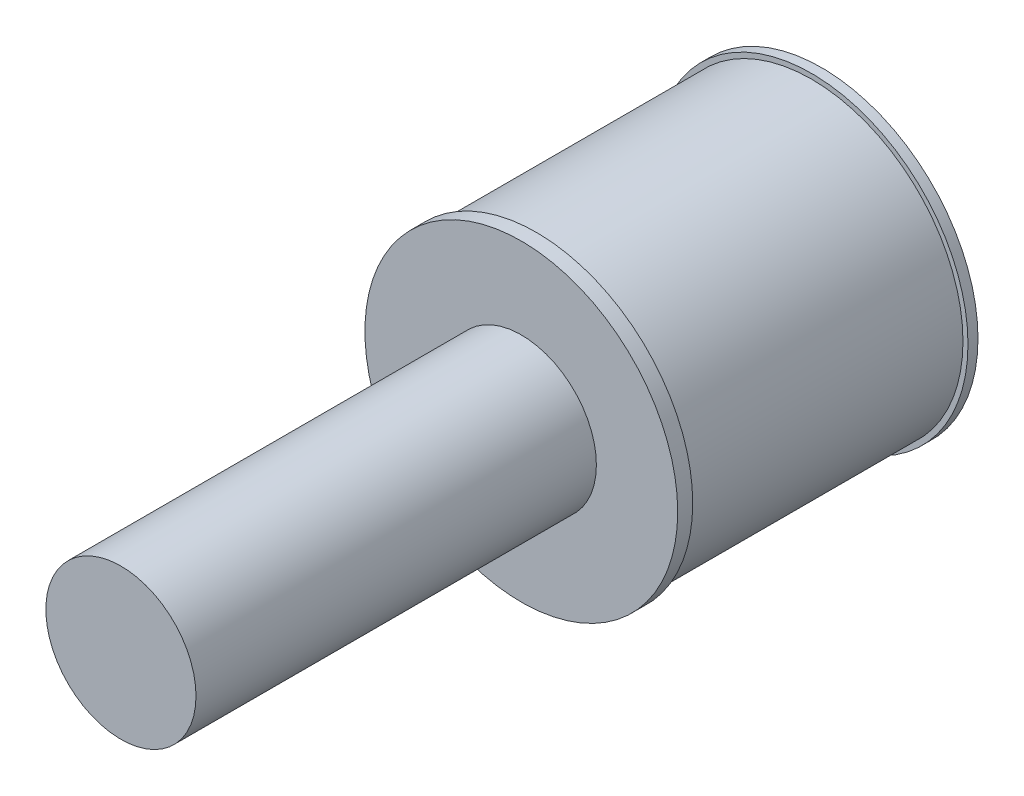
ISO-10303-21;
HEADER;
FILE_DESCRIPTION(('STEP AP214'),'2;1');
FILE_NAME('part.step','',(''),(''),'','','');
FILE_SCHEMA(('AUTOMOTIVE_DESIGN { 1 0 10303 214 1 1 1 1 }'));
ENDSEC;
DATA;
#1=APPLICATION_CONTEXT('core data for automotive mechanical design processes');
#2=APPLICATION_PROTOCOL_DEFINITION('international standard','automotive_design',2000,#1);
#3=PRODUCT_CONTEXT('',#1,'mechanical');
#4=PRODUCT('Part','Part','',(#3));
#5=PRODUCT_RELATED_PRODUCT_CATEGORY('part','',(#4));
#6=PRODUCT_DEFINITION_FORMATION('','',#4);
#7=PRODUCT_DEFINITION_CONTEXT('part definition',#1,'design');
#8=PRODUCT_DEFINITION('design','',#6,#7);
#9=PRODUCT_DEFINITION_SHAPE('','',#8);
#10=(LENGTH_UNIT() NAMED_UNIT(*) SI_UNIT(.MILLI.,.METRE.));
#11=(NAMED_UNIT(*) PLANE_ANGLE_UNIT() SI_UNIT($,.RADIAN.));
#12=(NAMED_UNIT(*) SI_UNIT($,.STERADIAN.) SOLID_ANGLE_UNIT());
#13=UNCERTAINTY_MEASURE_WITH_UNIT(LENGTH_MEASURE(1.E-05),#10,'distance_accuracy_value','');
#14=(GEOMETRIC_REPRESENTATION_CONTEXT(3) GLOBAL_UNCERTAINTY_ASSIGNED_CONTEXT((#13)) GLOBAL_UNIT_ASSIGNED_CONTEXT((#10,
#11,#12)) REPRESENTATION_CONTEXT('',''));
#15=CARTESIAN_POINT('',(0.,0.,0.));
#16=DIRECTION('',(0.,0.,1.));
#17=DIRECTION('',(1.,0.,0.));
#18=AXIS2_PLACEMENT_3D('',#15,#16,#17);
#19=CARTESIAN_POINT('',(0.,0.,0.));
#20=DIRECTION('',(0.,0.,1.));
#21=DIRECTION('',(1.,0.,0.));
#22=AXIS2_PLACEMENT_3D('',#19,#20,#21);
#23=PLANE('',#22);
#24=CARTESIAN_POINT('',(0.,0.,0.));
#25=DIRECTION('',(0.,0.,1.));
#26=DIRECTION('',(1.,0.,0.));
#27=AXIS2_PLACEMENT_3D('',#24,#25,#26);
#28=CIRCLE('',#27,6.25);
#29=CARTESIAN_POINT('',(6.25,0.,0.));
#30=VERTEX_POINT('',#29);
#31=EDGE_CURVE('E120',#30,#30,#28,.T.);
#32=ORIENTED_EDGE('',*,*,#31,.F.);
#33=EDGE_LOOP('',(#32));
#34=FACE_BOUND('',#33,.T.);
#35=DIRECTION('',(0.,1.,0.));
#36=VECTOR('',#35,1.);
#37=CARTESIAN_POINT('',(-4.2,0.,0.));
#38=LINE('',#37,#36);
#39=CARTESIAN_POINT('',(-4.2,-0.7,0.));
#40=VERTEX_POINT('',#39);
#41=CARTESIAN_POINT('',(-4.2,0.7,0.));
#42=VERTEX_POINT('',#41);
#43=EDGE_CURVE('E11',#40,#42,#38,.T.);
#44=ORIENTED_EDGE('',*,*,#43,.F.);
#45=DIRECTION('',(-1.,0.,0.));
#46=VECTOR('',#45,1.);
#47=CARTESIAN_POINT('',(0.,-0.7,0.));
#48=LINE('',#47,#46);
#49=CARTESIAN_POINT('',(4.2,-0.7,0.));
#50=VERTEX_POINT('',#49);
#51=EDGE_CURVE('E50',#50,#40,#48,.T.);
#52=ORIENTED_EDGE('',*,*,#51,.F.);
#53=DIRECTION('',(0.,-1.,0.));
#54=VECTOR('',#53,1.);
#55=CARTESIAN_POINT('',(4.2,0.,0.));
#56=LINE('',#55,#54);
#57=CARTESIAN_POINT('',(4.2,0.7,0.));
#58=VERTEX_POINT('',#57);
#59=EDGE_CURVE('E128',#58,#50,#56,.T.);
#60=ORIENTED_EDGE('',*,*,#59,.F.);
#61=DIRECTION('',(1.,0.,0.));
#62=VECTOR('',#61,1.);
#63=CARTESIAN_POINT('',(0.,0.7,0.));
#64=LINE('',#63,#62);
#65=EDGE_CURVE('E110',#42,#58,#64,.T.);
#66=ORIENTED_EDGE('',*,*,#65,.F.);
#67=EDGE_LOOP('',(#44,#52,#60,#66));
#68=FACE_BOUND('',#67,.T.);
#69=ADVANCED_FACE('F39',(#34,#68),#23,.F.);
#70=CARTESIAN_POINT('',(0.,0.,0.4));
#71=DIRECTION('',(0.,0.,-1.));
#72=DIRECTION('',(-1.,0.,0.));
#73=AXIS2_PLACEMENT_3D('',#70,#71,#72);
#74=CYLINDRICAL_SURFACE('',#73,6.25);
#75=CARTESIAN_POINT('',(0.,0.,0.4));
#76=DIRECTION('',(0.,0.,1.));
#77=DIRECTION('',(1.,0.,0.));
#78=AXIS2_PLACEMENT_3D('',#75,#76,#77);
#79=CIRCLE('',#78,6.25);
#80=CARTESIAN_POINT('',(6.25,0.,0.4));
#81=VERTEX_POINT('',#80);
#82=EDGE_CURVE('E119',#81,#81,#79,.T.);
#83=ORIENTED_EDGE('',*,*,#82,.F.);
#84=EDGE_LOOP('',(#83));
#85=FACE_BOUND('',#84,.T.);
#86=ORIENTED_EDGE('',*,*,#31,.T.);
#87=EDGE_LOOP('',(#86));
#88=FACE_BOUND('',#87,.T.);
#89=ADVANCED_FACE('F41',(#85,#88),#74,.T.);
#90=CARTESIAN_POINT('',(0.,0.,0.4));
#91=DIRECTION('',(0.,0.,1.));
#92=DIRECTION('',(1.,0.,0.));
#93=AXIS2_PLACEMENT_3D('',#90,#91,#92);
#94=PLANE('',#93);
#95=CARTESIAN_POINT('',(0.,0.,0.4));
#96=DIRECTION('',(0.,0.,1.));
#97=DIRECTION('',(1.,0.,0.));
#98=AXIS2_PLACEMENT_3D('',#95,#96,#97);
#99=CIRCLE('',#98,6.05);
#100=CARTESIAN_POINT('',(6.05,0.,0.4));
#101=VERTEX_POINT('',#100);
#102=EDGE_CURVE('E108',#101,#101,#99,.T.);
#103=ORIENTED_EDGE('',*,*,#102,.F.);
#104=EDGE_LOOP('',(#103));
#105=FACE_BOUND('',#104,.T.);
#106=ORIENTED_EDGE('',*,*,#82,.T.);
#107=EDGE_LOOP('',(#106));
#108=FACE_BOUND('',#107,.T.);
#109=ADVANCED_FACE('F153',(#105,#108),#94,.T.);
#110=CARTESIAN_POINT('',(0.,0.,11.4));
#111=DIRECTION('',(0.,0.,-1.));
#112=DIRECTION('',(-1.,0.,0.));
#113=AXIS2_PLACEMENT_3D('',#110,#111,#112);
#114=CYLINDRICAL_SURFACE('',#113,6.05);
#115=CARTESIAN_POINT('',(0.,0.,11.4));
#116=DIRECTION('',(0.,0.,1.));
#117=DIRECTION('',(1.,0.,0.));
#118=AXIS2_PLACEMENT_3D('',#115,#116,#117);
#119=CIRCLE('',#118,6.05);
#120=CARTESIAN_POINT('',(6.05,0.,11.4));
#121=VERTEX_POINT('',#120);
#122=EDGE_CURVE('E115',#121,#121,#119,.T.);
#123=ORIENTED_EDGE('',*,*,#122,.F.);
#124=EDGE_LOOP('',(#123));
#125=FACE_BOUND('',#124,.T.);
#126=ORIENTED_EDGE('',*,*,#102,.T.);
#127=EDGE_LOOP('',(#126));
#128=FACE_BOUND('',#127,.T.);
#129=ADVANCED_FACE('F158',(#125,#128),#114,.T.);
#130=CARTESIAN_POINT('',(0.,0.,12.));
#131=DIRECTION('',(0.,0.,-1.));
#132=DIRECTION('',(-1.,0.,0.));
#133=AXIS2_PLACEMENT_3D('',#130,#131,#132);
#134=CYLINDRICAL_SURFACE('',#133,6.25);
#135=CARTESIAN_POINT('',(0.,0.,12.));
#136=DIRECTION('',(0.,0.,1.));
#137=DIRECTION('',(1.,0.,0.));
#138=AXIS2_PLACEMENT_3D('',#135,#136,#137);
#139=CIRCLE('',#138,6.25);
#140=CARTESIAN_POINT('',(6.25,0.,12.));
#141=VERTEX_POINT('',#140);
#142=EDGE_CURVE('E107',#141,#141,#139,.T.);
#143=ORIENTED_EDGE('',*,*,#142,.F.);
#144=EDGE_LOOP('',(#143));
#145=FACE_BOUND('',#144,.T.);
#146=CARTESIAN_POINT('',(0.,0.,11.4));
#147=DIRECTION('',(0.,0.,1.));
#148=DIRECTION('',(1.,0.,0.));
#149=AXIS2_PLACEMENT_3D('',#146,#147,#148);
#150=CIRCLE('',#149,6.25);
#151=CARTESIAN_POINT('',(6.25,0.,11.4));
#152=VERTEX_POINT('',#151);
#153=EDGE_CURVE('E96',#152,#152,#150,.T.);
#154=ORIENTED_EDGE('',*,*,#153,.T.);
#155=EDGE_LOOP('',(#154));
#156=FACE_BOUND('',#155,.T.);
#157=ADVANCED_FACE('F165',(#145,#156),#134,.T.);
#158=CARTESIAN_POINT('',(0.,0.,12.));
#159=DIRECTION('',(0.,0.,1.));
#160=DIRECTION('',(1.,0.,0.));
#161=AXIS2_PLACEMENT_3D('',#158,#159,#160);
#162=PLANE('',#161);
#163=CARTESIAN_POINT('',(0.,0.,12.));
#164=DIRECTION('',(0.,0.,1.));
#165=DIRECTION('',(1.,0.,0.));
#166=AXIS2_PLACEMENT_3D('',#163,#164,#165);
#167=CIRCLE('',#166,3.);
#168=CARTESIAN_POINT('',(3.,0.,12.));
#169=VERTEX_POINT('',#168);
#170=EDGE_CURVE('E104',#169,#169,#167,.T.);
#171=ORIENTED_EDGE('',*,*,#170,.F.);
#172=EDGE_LOOP('',(#171));
#173=FACE_BOUND('',#172,.T.);
#174=ORIENTED_EDGE('',*,*,#142,.T.);
#175=EDGE_LOOP('',(#174));
#176=FACE_BOUND('',#175,.T.);
#177=ADVANCED_FACE('F166',(#173,#176),#162,.T.);
#178=CARTESIAN_POINT('',(0.,0.,11.4));
#179=DIRECTION('',(0.,0.,1.));
#180=DIRECTION('',(1.,0.,0.));
#181=AXIS2_PLACEMENT_3D('',#178,#179,#180);
#182=PLANE('',#181);
#183=ORIENTED_EDGE('',*,*,#122,.T.);
#184=EDGE_LOOP('',(#183));
#185=FACE_BOUND('',#184,.T.);
#186=ORIENTED_EDGE('',*,*,#153,.F.);
#187=EDGE_LOOP('',(#186));
#188=FACE_BOUND('',#187,.T.);
#189=ADVANCED_FACE('F167',(#185,#188),#182,.F.);
#190=CARTESIAN_POINT('',(0.,0.,28.));
#191=DIRECTION('',(0.,0.,-1.));
#192=DIRECTION('',(-1.,0.,0.));
#193=AXIS2_PLACEMENT_3D('',#190,#191,#192);
#194=CYLINDRICAL_SURFACE('',#193,3.);
#195=CARTESIAN_POINT('',(0.,0.,28.));
#196=DIRECTION('',(0.,0.,1.));
#197=DIRECTION('',(1.,0.,0.));
#198=AXIS2_PLACEMENT_3D('',#195,#196,#197);
#199=CIRCLE('',#198,3.);
#200=CARTESIAN_POINT('',(3.,0.,28.));
#201=VERTEX_POINT('',#200);
#202=EDGE_CURVE('E91',#201,#201,#199,.T.);
#203=ORIENTED_EDGE('',*,*,#202,.F.);
#204=EDGE_LOOP('',(#203));
#205=FACE_BOUND('',#204,.T.);
#206=ORIENTED_EDGE('',*,*,#170,.T.);
#207=EDGE_LOOP('',(#206));
#208=FACE_BOUND('',#207,.T.);
#209=ADVANCED_FACE('F173',(#205,#208),#194,.T.);
#210=CARTESIAN_POINT('',(0.,0.,28.));
#211=DIRECTION('',(0.,0.,1.));
#212=DIRECTION('',(1.,0.,0.));
#213=AXIS2_PLACEMENT_3D('',#210,#211,#212);
#214=PLANE('',#213);
#215=ORIENTED_EDGE('',*,*,#202,.T.);
#216=EDGE_LOOP('',(#215));
#217=FACE_BOUND('',#216,.T.);
#218=ADVANCED_FACE('F179',(#217),#214,.T.);
#219=CARTESIAN_POINT('',(-4.2,0.7,0.6));
#220=DIRECTION('',(1.,0.,0.));
#221=DIRECTION('',(0.,0.,-1.));
#222=AXIS2_PLACEMENT_3D('',#219,#220,#221);
#223=PLANE('',#222);
#224=ORIENTED_EDGE('',*,*,#43,.T.);
#225=DIRECTION('',(0.,0.,-1.));
#226=VECTOR('',#225,1.);
#227=CARTESIAN_POINT('',(-4.2,0.7,0.6));
#228=LINE('',#227,#226);
#229=CARTESIAN_POINT('',(-4.2,0.7,0.6));
#230=VERTEX_POINT('',#229);
#231=EDGE_CURVE('E53',#230,#42,#228,.T.);
#232=ORIENTED_EDGE('',*,*,#231,.F.);
#233=DIRECTION('',(0.,-1.,0.));
#234=VECTOR('',#233,1.);
#235=CARTESIAN_POINT('',(-4.2,0.7,0.6));
#236=LINE('',#235,#234);
#237=CARTESIAN_POINT('',(-4.2,-0.7,0.6));
#238=VERTEX_POINT('',#237);
#239=EDGE_CURVE('E85',#230,#238,#236,.T.);
#240=ORIENTED_EDGE('',*,*,#239,.T.);
#241=DIRECTION('',(0.,0.,-1.));
#242=VECTOR('',#241,1.);
#243=CARTESIAN_POINT('',(-4.2,-0.7,0.6));
#244=LINE('',#243,#242);
#245=EDGE_CURVE('E90',#238,#40,#244,.T.);
#246=ORIENTED_EDGE('',*,*,#245,.T.);
#247=EDGE_LOOP('',(#224,#232,#240,#246));
#248=FACE_BOUND('',#247,.T.);
#249=ADVANCED_FACE('F88',(#248),#223,.T.);
#250=CARTESIAN_POINT('',(-4.2,-0.7,0.6));
#251=DIRECTION('',(0.,1.,0.));
#252=DIRECTION('',(0.,0.,1.));
#253=AXIS2_PLACEMENT_3D('',#250,#251,#252);
#254=PLANE('',#253);
#255=ORIENTED_EDGE('',*,*,#51,.T.);
#256=ORIENTED_EDGE('',*,*,#245,.F.);
#257=DIRECTION('',(1.,0.,0.));
#258=VECTOR('',#257,1.);
#259=CARTESIAN_POINT('',(-4.2,-0.7,0.6));
#260=LINE('',#259,#258);
#261=CARTESIAN_POINT('',(4.2,-0.7,0.6));
#262=VERTEX_POINT('',#261);
#263=EDGE_CURVE('E78',#238,#262,#260,.T.);
#264=ORIENTED_EDGE('',*,*,#263,.T.);
#265=DIRECTION('',(0.,0.,-1.));
#266=VECTOR('',#265,1.);
#267=CARTESIAN_POINT('',(4.2,-0.7,0.6));
#268=LINE('',#267,#266);
#269=EDGE_CURVE('E93',#262,#50,#268,.T.);
#270=ORIENTED_EDGE('',*,*,#269,.T.);
#271=EDGE_LOOP('',(#255,#256,#264,#270));
#272=FACE_BOUND('',#271,.T.);
#273=ADVANCED_FACE('F94',(#272),#254,.T.);
#274=CARTESIAN_POINT('',(4.2,-0.7,0.6));
#275=DIRECTION('',(-1.,0.,0.));
#276=DIRECTION('',(0.,0.,1.));
#277=AXIS2_PLACEMENT_3D('',#274,#275,#276);
#278=PLANE('',#277);
#279=ORIENTED_EDGE('',*,*,#59,.T.);
#280=ORIENTED_EDGE('',*,*,#269,.F.);
#281=DIRECTION('',(0.,1.,0.));
#282=VECTOR('',#281,1.);
#283=CARTESIAN_POINT('',(4.2,-0.7,0.6));
#284=LINE('',#283,#282);
#285=CARTESIAN_POINT('',(4.2,0.7,0.6));
#286=VERTEX_POINT('',#285);
#287=EDGE_CURVE('E81',#262,#286,#284,.T.);
#288=ORIENTED_EDGE('',*,*,#287,.T.);
#289=DIRECTION('',(0.,0.,-1.));
#290=VECTOR('',#289,1.);
#291=CARTESIAN_POINT('',(4.2,0.7,0.6));
#292=LINE('',#291,#290);
#293=EDGE_CURVE('E99',#286,#58,#292,.T.);
#294=ORIENTED_EDGE('',*,*,#293,.T.);
#295=EDGE_LOOP('',(#279,#280,#288,#294));
#296=FACE_BOUND('',#295,.T.);
#297=ADVANCED_FACE('F126',(#296),#278,.T.);
#298=CARTESIAN_POINT('',(4.2,0.7,0.6));
#299=DIRECTION('',(0.,-1.,0.));
#300=DIRECTION('',(0.,0.,-1.));
#301=AXIS2_PLACEMENT_3D('',#298,#299,#300);
#302=PLANE('',#301);
#303=ORIENTED_EDGE('',*,*,#65,.T.);
#304=ORIENTED_EDGE('',*,*,#293,.F.);
#305=DIRECTION('',(-1.,0.,0.));
#306=VECTOR('',#305,1.);
#307=CARTESIAN_POINT('',(4.2,0.7,0.6));
#308=LINE('',#307,#306);
#309=EDGE_CURVE('E135',#286,#230,#308,.T.);
#310=ORIENTED_EDGE('',*,*,#309,.T.);
#311=ORIENTED_EDGE('',*,*,#231,.T.);
#312=EDGE_LOOP('',(#303,#304,#310,#311));
#313=FACE_BOUND('',#312,.T.);
#314=ADVANCED_FACE('F133',(#313),#302,.T.);
#315=CARTESIAN_POINT('',(0.,0.,0.6));
#316=DIRECTION('',(0.,0.,1.));
#317=DIRECTION('',(1.,0.,0.));
#318=AXIS2_PLACEMENT_3D('',#315,#316,#317);
#319=PLANE('',#318);
#320=ORIENTED_EDGE('',*,*,#239,.F.);
#321=ORIENTED_EDGE('',*,*,#309,.F.);
#322=ORIENTED_EDGE('',*,*,#287,.F.);
#323=ORIENTED_EDGE('',*,*,#263,.F.);
#324=EDGE_LOOP('',(#320,#321,#322,#323));
#325=FACE_BOUND('',#324,.T.);
#326=ADVANCED_FACE('F84',(#325),#319,.F.);
#327=CLOSED_SHELL('',(#69,#89,#109,#129,#157,#177,#189,#209,#218,#249,#273,#297,#314,#326));
#328=MANIFOLD_SOLID_BREP('B2',#327);
#329=ADVANCED_BREP_SHAPE_REPRESENTATION('',(#18,#328),#14);
#330=SHAPE_DEFINITION_REPRESENTATION(#9,#329);
ENDSEC;
END-ISO-10303-21;
